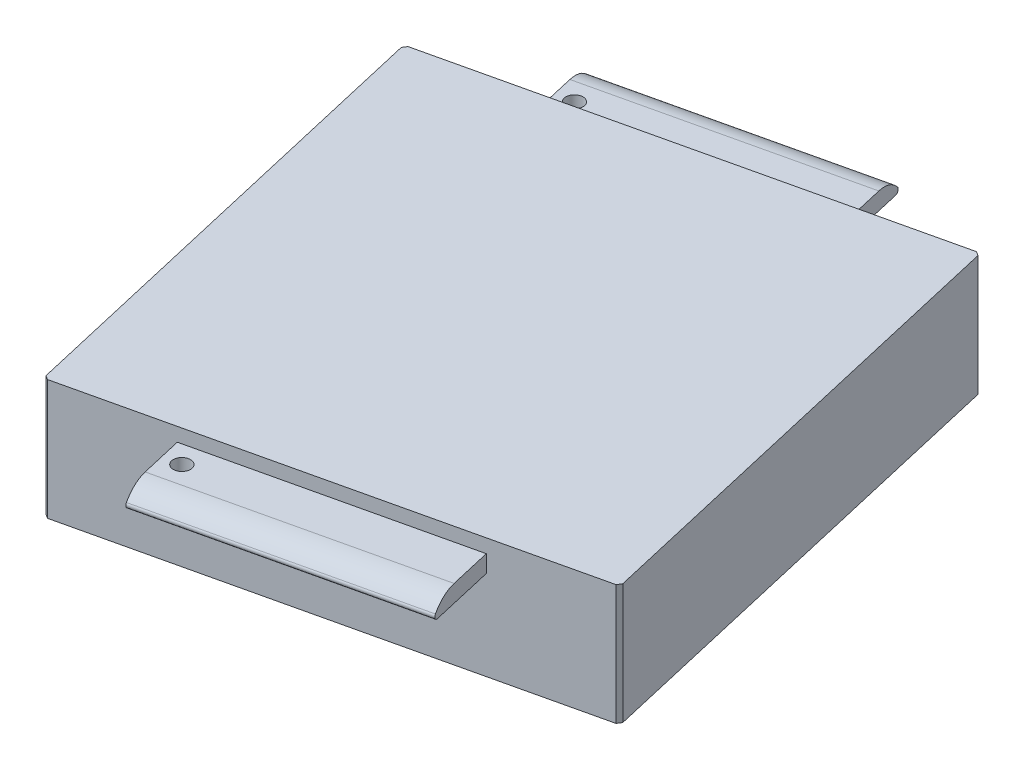
ISO-10303-21;
HEADER;
FILE_DESCRIPTION(('STEP AP214'),'2;1');
FILE_NAME('part.step','',(''),(''),'','','');
FILE_SCHEMA(('AUTOMOTIVE_DESIGN { 1 0 10303 214 1 1 1 1 }'));
ENDSEC;
DATA;
#1=APPLICATION_CONTEXT('core data for automotive mechanical design processes');
#2=APPLICATION_PROTOCOL_DEFINITION('international standard','automotive_design',2000,#1);
#3=PRODUCT_CONTEXT('',#1,'mechanical');
#4=PRODUCT('Part','Part','',(#3));
#5=PRODUCT_RELATED_PRODUCT_CATEGORY('part','',(#4));
#6=PRODUCT_DEFINITION_FORMATION('','',#4);
#7=PRODUCT_DEFINITION_CONTEXT('part definition',#1,'design');
#8=PRODUCT_DEFINITION('design','',#6,#7);
#9=PRODUCT_DEFINITION_SHAPE('','',#8);
#10=(LENGTH_UNIT() NAMED_UNIT(*) SI_UNIT(.MILLI.,.METRE.));
#11=(NAMED_UNIT(*) PLANE_ANGLE_UNIT() SI_UNIT($,.RADIAN.));
#12=(NAMED_UNIT(*) SI_UNIT($,.STERADIAN.) SOLID_ANGLE_UNIT());
#13=UNCERTAINTY_MEASURE_WITH_UNIT(LENGTH_MEASURE(1.E-05),#10,'distance_accuracy_value','');
#14=(GEOMETRIC_REPRESENTATION_CONTEXT(3) GLOBAL_UNCERTAINTY_ASSIGNED_CONTEXT((#13)) GLOBAL_UNIT_ASSIGNED_CONTEXT((#10,
#11,#12)) REPRESENTATION_CONTEXT('',''));
#15=CARTESIAN_POINT('',(0.,0.,0.));
#16=DIRECTION('',(0.,0.,1.));
#17=DIRECTION('',(1.,0.,0.));
#18=AXIS2_PLACEMENT_3D('',#15,#16,#17);
#19=CARTESIAN_POINT('',(321.32221095002,940.,-1642.4395520944));
#20=DIRECTION('',(-0.224951054343865,0.,-0.974370064785235));
#21=DIRECTION('',(-0.974370064785235,0.,0.224951054343865));
#22=AXIS2_PLACEMENT_3D('',#19,#20,#21);
#23=PLANE('',#22);
#24=DIRECTION('',(0.974370064785235,0.,-0.224951054343865));
#25=VECTOR('',#24,1.);
#26=CARTESIAN_POINT('',(321.32221095002,870.,-1642.4395520944));
#27=LINE('',#26,#25);
#28=CARTESIAN_POINT('',(321.32221095002,870.,-1642.4395520944));
#29=VERTEX_POINT('',#28);
#30=CARTESIAN_POINT('',(590.248348830745,870.,-1704.52604309331));
#31=VERTEX_POINT('',#30);
#32=EDGE_CURVE('E235',#29,#31,#27,.T.);
#33=ORIENTED_EDGE('',*,*,#32,.F.);
#34=DIRECTION('',(0.,-1.,0.));
#35=VECTOR('',#34,1.);
#36=CARTESIAN_POINT('',(321.32221095002,940.,-1642.4395520944));
#37=LINE('',#36,#35);
#38=CARTESIAN_POINT('',(321.32221095002,940.,-1642.4395520944));
#39=VERTEX_POINT('',#38);
#40=EDGE_CURVE('E11',#39,#29,#37,.T.);
#41=ORIENTED_EDGE('',*,*,#40,.F.);
#42=DIRECTION('',(0.974370064785235,0.,-0.224951054343865));
#43=VECTOR('',#42,1.);
#44=CARTESIAN_POINT('',(321.32221095002,940.,-1642.4395520944));
#45=LINE('',#44,#43);
#46=CARTESIAN_POINT('',(590.248348830745,940.,-1704.52604309331));
#47=VERTEX_POINT('',#46);
#48=EDGE_CURVE('E259',#39,#47,#45,.T.);
#49=ORIENTED_EDGE('',*,*,#48,.T.);
#50=DIRECTION('',(0.,-1.,0.));
#51=VECTOR('',#50,1.);
#52=CARTESIAN_POINT('',(590.248348830745,940.,-1704.52604309331));
#53=LINE('',#52,#51);
#54=EDGE_CURVE('E25',#47,#31,#53,.T.);
#55=ORIENTED_EDGE('',*,*,#54,.T.);
#56=EDGE_LOOP('',(#33,#41,#49,#55));
#57=FACE_BOUND('',#56,.T.);
#58=DIRECTION('',(0.974370064785235,0.,-0.224951054343865));
#59=VECTOR('',#58,1.);
#60=CARTESIAN_POINT('',(382.70752503149,932.,-1656.61146851807));
#61=LINE('',#60,#59);
#62=CARTESIAN_POINT('',(382.70752503149,932.,-1656.61146851807));
#63=VERTEX_POINT('',#62);
#64=CARTESIAN_POINT('',(528.863034749275,932.,-1690.35412666965));
#65=VERTEX_POINT('',#64);
#66=EDGE_CURVE('E32',#63,#65,#61,.T.);
#67=ORIENTED_EDGE('',*,*,#66,.F.);
#68=DIRECTION('',(0.,-1.,0.));
#69=VECTOR('',#68,1.);
#70=CARTESIAN_POINT('',(382.70752503149,932.,-1656.61146851807));
#71=LINE('',#70,#69);
#72=CARTESIAN_POINT('',(382.70752503149,922.,-1656.61146851807));
#73=VERTEX_POINT('',#72);
#74=EDGE_CURVE('E36',#63,#73,#71,.T.);
#75=ORIENTED_EDGE('',*,*,#74,.T.);
#76=DIRECTION('',(0.974370064785235,0.,-0.224951054343865));
#77=VECTOR('',#76,1.);
#78=CARTESIAN_POINT('',(382.70752503149,922.,-1656.61146851807));
#79=LINE('',#78,#77);
#80=CARTESIAN_POINT('',(528.863034749275,922.,-1690.35412666965));
#81=VERTEX_POINT('',#80);
#82=EDGE_CURVE('E136',#73,#81,#79,.T.);
#83=ORIENTED_EDGE('',*,*,#82,.T.);
#84=DIRECTION('',(0.,-1.,0.));
#85=VECTOR('',#84,1.);
#86=CARTESIAN_POINT('',(528.863034749275,932.,-1690.35412666965));
#87=LINE('',#86,#85);
#88=EDGE_CURVE('E139',#65,#81,#87,.T.);
#89=ORIENTED_EDGE('',*,*,#88,.F.);
#90=EDGE_LOOP('',(#67,#75,#83,#89));
#91=FACE_BOUND('',#90,.T.);
#92=ADVANCED_FACE('F17',(#57,#91),#23,.T.);
#93=CARTESIAN_POINT('',(319.823372929137,940.,-1640.04090985614));
#94=DIRECTION('',(-0.848048096156426,0.,-0.529919264233205));
#95=DIRECTION('',(-0.529919264233205,0.,0.848048096156426));
#96=AXIS2_PLACEMENT_3D('',#93,#94,#95);
#97=PLANE('',#96);
#98=DIRECTION('',(0.529919264233205,0.,-0.848048096156426));
#99=VECTOR('',#98,1.);
#100=CARTESIAN_POINT('',(319.823372929137,870.,-1640.04090985614));
#101=LINE('',#100,#99);
#102=CARTESIAN_POINT('',(319.823372929137,870.,-1640.04090985614));
#103=VERTEX_POINT('',#102);
#104=EDGE_CURVE('E232',#103,#29,#101,.T.);
#105=ORIENTED_EDGE('',*,*,#104,.F.);
#106=DIRECTION('',(0.,-1.,0.));
#107=VECTOR('',#106,1.);
#108=CARTESIAN_POINT('',(319.823372929137,940.,-1640.04090985614));
#109=LINE('',#108,#107);
#110=CARTESIAN_POINT('',(319.823372929137,940.,-1640.04090985614));
#111=VERTEX_POINT('',#110);
#112=EDGE_CURVE('E280',#111,#103,#109,.T.);
#113=ORIENTED_EDGE('',*,*,#112,.F.);
#114=DIRECTION('',(0.529919264233205,0.,-0.848048096156426));
#115=VECTOR('',#114,1.);
#116=CARTESIAN_POINT('',(319.823372929137,940.,-1640.04090985614));
#117=LINE('',#116,#115);
#118=EDGE_CURVE('E256',#111,#39,#117,.T.);
#119=ORIENTED_EDGE('',*,*,#118,.T.);
#120=ORIENTED_EDGE('',*,*,#40,.T.);
#121=EDGE_LOOP('',(#105,#113,#119,#120));
#122=FACE_BOUND('',#121,.T.);
#123=ADVANCED_FACE('F19',(#122),#97,.T.);
#124=CARTESIAN_POINT('',(590.248348830745,940.,-1704.52604309331));
#125=DIRECTION('',(0.529919264233205,0.,-0.848048096156426));
#126=DIRECTION('',(-0.848048096156426,0.,-0.529919264233205));
#127=AXIS2_PLACEMENT_3D('',#124,#125,#126);
#128=PLANE('',#127);
#129=DIRECTION('',(0.848048096156426,0.,0.529919264233205));
#130=VECTOR('',#129,1.);
#131=CARTESIAN_POINT('',(590.248348830745,870.,-1704.52604309331));
#132=LINE('',#131,#130);
#133=CARTESIAN_POINT('',(592.646991069003,870.,-1703.02720507243));
#134=VERTEX_POINT('',#133);
#135=EDGE_CURVE('E238',#31,#134,#132,.T.);
#136=ORIENTED_EDGE('',*,*,#135,.F.);
#137=ORIENTED_EDGE('',*,*,#54,.F.);
#138=DIRECTION('',(0.848048096156426,0.,0.529919264233205));
#139=VECTOR('',#138,1.);
#140=CARTESIAN_POINT('',(590.248348830745,940.,-1704.52604309331));
#141=LINE('',#140,#139);
#142=CARTESIAN_POINT('',(592.646991069003,940.,-1703.02720507243));
#143=VERTEX_POINT('',#142);
#144=EDGE_CURVE('E262',#47,#143,#141,.T.);
#145=ORIENTED_EDGE('',*,*,#144,.T.);
#146=DIRECTION('',(0.,-1.,0.));
#147=VECTOR('',#146,1.);
#148=CARTESIAN_POINT('',(592.646991069003,940.,-1703.02720507243));
#149=LINE('',#148,#147);
#150=EDGE_CURVE('E292',#143,#134,#149,.T.);
#151=ORIENTED_EDGE('',*,*,#150,.T.);
#152=EDGE_LOOP('',(#136,#137,#145,#151));
#153=FACE_BOUND('',#152,.T.);
#154=ADVANCED_FACE('F299',(#153),#128,.T.);
#155=CARTESIAN_POINT('',(592.646991069003,940.,-1703.02720507243));
#156=DIRECTION('',(0.974370064785235,0.,-0.224951054343865));
#157=DIRECTION('',(-0.224951054343865,0.,-0.974370064785235));
#158=AXIS2_PLACEMENT_3D('',#155,#156,#157);
#159=PLANE('',#158);
#160=DIRECTION('',(0.224951054343865,0.,0.974370064785235));
#161=VECTOR('',#160,1.);
#162=CARTESIAN_POINT('',(592.646991069003,870.,-1703.02720507243));
#163=LINE('',#162,#161);
#164=CARTESIAN_POINT('',(654.73348206791,870.,-1434.1010671917));
#165=VERTEX_POINT('',#164);
#166=EDGE_CURVE('E241',#134,#165,#163,.T.);
#167=ORIENTED_EDGE('',*,*,#166,.F.);
#168=ORIENTED_EDGE('',*,*,#150,.F.);
#169=DIRECTION('',(0.224951054343865,0.,0.974370064785235));
#170=VECTOR('',#169,1.);
#171=CARTESIAN_POINT('',(592.646991069003,940.,-1703.02720507243));
#172=LINE('',#171,#170);
#173=CARTESIAN_POINT('',(654.73348206791,940.,-1434.1010671917));
#174=VERTEX_POINT('',#173);
#175=EDGE_CURVE('E265',#143,#174,#172,.T.);
#176=ORIENTED_EDGE('',*,*,#175,.T.);
#177=DIRECTION('',(0.,-1.,0.));
#178=VECTOR('',#177,1.);
#179=CARTESIAN_POINT('',(654.73348206791,940.,-1434.1010671917));
#180=LINE('',#179,#178);
#181=EDGE_CURVE('E290',#174,#165,#180,.T.);
#182=ORIENTED_EDGE('',*,*,#181,.T.);
#183=EDGE_LOOP('',(#167,#168,#176,#182));
#184=FACE_BOUND('',#183,.T.);
#185=ADVANCED_FACE('F314',(#184),#159,.T.);
#186=CARTESIAN_POINT('',(654.73348206791,940.,-1434.1010671917));
#187=DIRECTION('',(0.848048096156426,0.,0.529919264233205));
#188=DIRECTION('',(0.529919264233205,0.,-0.848048096156426));
#189=AXIS2_PLACEMENT_3D('',#186,#187,#188);
#190=PLANE('',#189);
#191=DIRECTION('',(-0.529919264233205,0.,0.848048096156426));
#192=VECTOR('',#191,1.);
#193=CARTESIAN_POINT('',(654.73348206791,870.,-1434.1010671917));
#194=LINE('',#193,#192);
#195=CARTESIAN_POINT('',(653.234644047027,870.,-1431.70242495344));
#196=VERTEX_POINT('',#195);
#197=EDGE_CURVE('E244',#165,#196,#194,.T.);
#198=ORIENTED_EDGE('',*,*,#197,.F.);
#199=ORIENTED_EDGE('',*,*,#181,.F.);
#200=DIRECTION('',(-0.529919264233205,0.,0.848048096156426));
#201=VECTOR('',#200,1.);
#202=CARTESIAN_POINT('',(654.73348206791,940.,-1434.1010671917));
#203=LINE('',#202,#201);
#204=CARTESIAN_POINT('',(653.234644047027,940.,-1431.70242495344));
#205=VERTEX_POINT('',#204);
#206=EDGE_CURVE('E268',#174,#205,#203,.T.);
#207=ORIENTED_EDGE('',*,*,#206,.T.);
#208=DIRECTION('',(0.,-1.,0.));
#209=VECTOR('',#208,1.);
#210=CARTESIAN_POINT('',(653.234644047027,940.,-1431.70242495344));
#211=LINE('',#210,#209);
#212=EDGE_CURVE('E288',#205,#196,#211,.T.);
#213=ORIENTED_EDGE('',*,*,#212,.T.);
#214=EDGE_LOOP('',(#198,#199,#207,#213));
#215=FACE_BOUND('',#214,.T.);
#216=ADVANCED_FACE('F318',(#215),#190,.T.);
#217=CARTESIAN_POINT('',(653.234644047027,940.,-1431.70242495344));
#218=DIRECTION('',(0.224951054343865,0.,0.974370064785235));
#219=DIRECTION('',(0.974370064785235,0.,-0.224951054343865));
#220=AXIS2_PLACEMENT_3D('',#217,#218,#219);
#221=PLANE('',#220);
#222=DIRECTION('',(0.,-1.,0.));
#223=VECTOR('',#222,1.);
#224=CARTESIAN_POINT('',(445.693820247772,932.,-1383.7878503782));
#225=LINE('',#224,#223);
#226=CARTESIAN_POINT('',(445.693820247772,932.,-1383.7878503782));
#227=VERTEX_POINT('',#226);
#228=CARTESIAN_POINT('',(445.693820247772,922.,-1383.7878503782));
#229=VERTEX_POINT('',#228);
#230=EDGE_CURVE('E205',#227,#229,#225,.T.);
#231=ORIENTED_EDGE('',*,*,#230,.F.);
#232=DIRECTION('',(0.974370064785235,0.,-0.224951054343865));
#233=VECTOR('',#232,1.);
#234=CARTESIAN_POINT('',(445.693820247772,932.,-1383.7878503782));
#235=LINE('',#234,#233);
#236=CARTESIAN_POINT('',(591.849329965557,932.,-1417.53050852978));
#237=VERTEX_POINT('',#236);
#238=EDGE_CURVE('E230',#227,#237,#235,.T.);
#239=ORIENTED_EDGE('',*,*,#238,.T.);
#240=DIRECTION('',(0.,-1.,0.));
#241=VECTOR('',#240,1.);
#242=CARTESIAN_POINT('',(591.849329965557,932.,-1417.53050852978));
#243=LINE('',#242,#241);
#244=CARTESIAN_POINT('',(591.849329965557,922.,-1417.53050852978));
#245=VERTEX_POINT('',#244);
#246=EDGE_CURVE('E191',#237,#245,#243,.T.);
#247=ORIENTED_EDGE('',*,*,#246,.T.);
#248=DIRECTION('',(0.974370064785235,0.,-0.224951054343865));
#249=VECTOR('',#248,1.);
#250=CARTESIAN_POINT('',(445.693820247772,922.,-1383.7878503782));
#251=LINE('',#250,#249);
#252=EDGE_CURVE('E227',#229,#245,#251,.T.);
#253=ORIENTED_EDGE('',*,*,#252,.F.);
#254=EDGE_LOOP('',(#231,#239,#247,#253));
#255=FACE_BOUND('',#254,.T.);
#256=DIRECTION('',(-0.974370064785235,0.,0.224951054343865));
#257=VECTOR('',#256,1.);
#258=CARTESIAN_POINT('',(653.234644047027,870.,-1431.70242495344));
#259=LINE('',#258,#257);
#260=CARTESIAN_POINT('',(384.308506166301,870.,-1369.61593395454));
#261=VERTEX_POINT('',#260);
#262=EDGE_CURVE('E247',#196,#261,#259,.T.);
#263=ORIENTED_EDGE('',*,*,#262,.F.);
#264=ORIENTED_EDGE('',*,*,#212,.F.);
#265=DIRECTION('',(-0.974370064785235,0.,0.224951054343865));
#266=VECTOR('',#265,1.);
#267=CARTESIAN_POINT('',(653.234644047027,940.,-1431.70242495344));
#268=LINE('',#267,#266);
#269=CARTESIAN_POINT('',(384.308506166301,940.,-1369.61593395454));
#270=VERTEX_POINT('',#269);
#271=EDGE_CURVE('E271',#205,#270,#268,.T.);
#272=ORIENTED_EDGE('',*,*,#271,.T.);
#273=DIRECTION('',(0.,-1.,0.));
#274=VECTOR('',#273,1.);
#275=CARTESIAN_POINT('',(384.308506166301,940.,-1369.61593395454));
#276=LINE('',#275,#274);
#277=EDGE_CURVE('E286',#270,#261,#276,.T.);
#278=ORIENTED_EDGE('',*,*,#277,.T.);
#279=EDGE_LOOP('',(#263,#264,#272,#278));
#280=FACE_BOUND('',#279,.T.);
#281=ADVANCED_FACE('F320',(#255,#280),#221,.T.);
#282=CARTESIAN_POINT('',(384.308506166301,940.,-1369.61593395454));
#283=DIRECTION('',(-0.529919264233205,0.,0.848048096156426));
#284=DIRECTION('',(0.848048096156426,0.,0.529919264233205));
#285=AXIS2_PLACEMENT_3D('',#282,#283,#284);
#286=PLANE('',#285);
#287=DIRECTION('',(-0.848048096156426,0.,-0.529919264233205));
#288=VECTOR('',#287,1.);
#289=CARTESIAN_POINT('',(384.308506166301,870.,-1369.61593395454));
#290=LINE('',#289,#288);
#291=CARTESIAN_POINT('',(381.909863928044,870.,-1371.11477197542));
#292=VERTEX_POINT('',#291);
#293=EDGE_CURVE('E250',#261,#292,#290,.T.);
#294=ORIENTED_EDGE('',*,*,#293,.F.);
#295=ORIENTED_EDGE('',*,*,#277,.F.);
#296=DIRECTION('',(-0.848048096156426,0.,-0.529919264233205));
#297=VECTOR('',#296,1.);
#298=CARTESIAN_POINT('',(384.308506166301,940.,-1369.61593395454));
#299=LINE('',#298,#297);
#300=CARTESIAN_POINT('',(381.909863928044,940.,-1371.11477197542));
#301=VERTEX_POINT('',#300);
#302=EDGE_CURVE('E274',#270,#301,#299,.T.);
#303=ORIENTED_EDGE('',*,*,#302,.T.);
#304=DIRECTION('',(0.,-1.,0.));
#305=VECTOR('',#304,1.);
#306=CARTESIAN_POINT('',(381.909863928044,940.,-1371.11477197542));
#307=LINE('',#306,#305);
#308=EDGE_CURVE('E284',#301,#292,#307,.T.);
#309=ORIENTED_EDGE('',*,*,#308,.T.);
#310=EDGE_LOOP('',(#294,#295,#303,#309));
#311=FACE_BOUND('',#310,.T.);
#312=ADVANCED_FACE('F324',(#311),#286,.T.);
#313=CARTESIAN_POINT('',(381.909863928044,940.,-1371.11477197542));
#314=DIRECTION('',(-0.974370064785235,0.,0.224951054343865));
#315=DIRECTION('',(0.224951054343865,0.,0.974370064785235));
#316=AXIS2_PLACEMENT_3D('',#313,#314,#315);
#317=PLANE('',#316);
#318=DIRECTION('',(-0.224951054343865,0.,-0.974370064785235));
#319=VECTOR('',#318,1.);
#320=CARTESIAN_POINT('',(381.909863928044,870.,-1371.11477197542));
#321=LINE('',#320,#319);
#322=EDGE_CURVE('E253',#292,#103,#321,.T.);
#323=ORIENTED_EDGE('',*,*,#322,.F.);
#324=ORIENTED_EDGE('',*,*,#308,.F.);
#325=DIRECTION('',(-0.224951054343865,0.,-0.974370064785235));
#326=VECTOR('',#325,1.);
#327=CARTESIAN_POINT('',(381.909863928044,940.,-1371.11477197542));
#328=LINE('',#327,#326);
#329=EDGE_CURVE('E277',#301,#111,#328,.T.);
#330=ORIENTED_EDGE('',*,*,#329,.T.);
#331=ORIENTED_EDGE('',*,*,#112,.T.);
#332=EDGE_LOOP('',(#323,#324,#330,#331));
#333=FACE_BOUND('',#332,.T.);
#334=ADVANCED_FACE('F326',(#333),#317,.T.);
#335=CARTESIAN_POINT('',(424.742034390929,940.,-1807.94586653422));
#336=DIRECTION('',(0.,-1.,0.));
#337=DIRECTION('',(-0.224951054343865,0.,-0.974370064785235));
#338=AXIS2_PLACEMENT_3D('',#335,#336,#337);
#339=PLANE('',#338);
#340=ORIENTED_EDGE('',*,*,#118,.F.);
#341=ORIENTED_EDGE('',*,*,#329,.F.);
#342=ORIENTED_EDGE('',*,*,#302,.F.);
#343=ORIENTED_EDGE('',*,*,#271,.F.);
#344=ORIENTED_EDGE('',*,*,#206,.F.);
#345=ORIENTED_EDGE('',*,*,#175,.F.);
#346=ORIENTED_EDGE('',*,*,#144,.F.);
#347=ORIENTED_EDGE('',*,*,#48,.F.);
#348=EDGE_LOOP('',(#340,#341,#342,#343,#344,#345,#346,#347));
#349=FACE_BOUND('',#348,.T.);
#350=ADVANCED_FACE('F308',(#349),#339,.F.);
#351=CARTESIAN_POINT('',(424.742034390929,870.,-1807.94586653422));
#352=DIRECTION('',(0.,-1.,0.));
#353=DIRECTION('',(-0.224951054343865,0.,-0.974370064785235));
#354=AXIS2_PLACEMENT_3D('',#351,#352,#353);
#355=PLANE('',#354);
#356=ORIENTED_EDGE('',*,*,#104,.T.);
#357=ORIENTED_EDGE('',*,*,#32,.T.);
#358=ORIENTED_EDGE('',*,*,#135,.T.);
#359=ORIENTED_EDGE('',*,*,#166,.T.);
#360=ORIENTED_EDGE('',*,*,#197,.T.);
#361=ORIENTED_EDGE('',*,*,#262,.T.);
#362=ORIENTED_EDGE('',*,*,#293,.T.);
#363=ORIENTED_EDGE('',*,*,#322,.T.);
#364=EDGE_LOOP('',(#356,#357,#358,#359,#360,#361,#362,#363));
#365=FACE_BOUND('',#364,.T.);
#366=ADVANCED_FACE('F302',(#365),#355,.T.);
#367=CARTESIAN_POINT('',(451.317596606368,932.,-1359.42859875857));
#368=DIRECTION('',(0.,1.,0.));
#369=DIRECTION('',(0.224951054343865,0.,0.974370064785235));
#370=AXIS2_PLACEMENT_3D('',#367,#368,#369);
#371=PLANE('',#370);
#372=CARTESIAN_POINT('',(458.249409074923,932.,-1373.85773511182));
#373=DIRECTION('',(0.,1.,0.));
#374=DIRECTION('',(0.224951054343865,0.,0.974370064785235));
#375=AXIS2_PLACEMENT_3D('',#372,#373,#374);
#376=CIRCLE('',#375,5.);
#377=CARTESIAN_POINT('',(459.374164346642,932.,-1368.9858847879));
#378=VERTEX_POINT('',#377);
#379=EDGE_CURVE('E185',#378,#378,#376,.T.);
#380=ORIENTED_EDGE('',*,*,#379,.F.);
#381=EDGE_LOOP('',(#380));
#382=FACE_BOUND('',#381,.T.);
#383=DIRECTION('',(-0.224951054343865,0.,-0.974370064785235));
#384=VECTOR('',#383,1.);
#385=CARTESIAN_POINT('',(597.473106324153,932.,-1393.17125691015));
#386=LINE('',#385,#384);
#387=CARTESIAN_POINT('',(597.473106324153,932.,-1393.17125691015));
#388=VERTEX_POINT('',#387);
#389=EDGE_CURVE('E194',#388,#237,#386,.T.);
#390=ORIENTED_EDGE('',*,*,#389,.T.);
#391=ORIENTED_EDGE('',*,*,#238,.F.);
#392=DIRECTION('',(-0.224951054343865,0.,-0.974370064785235));
#393=VECTOR('',#392,1.);
#394=CARTESIAN_POINT('',(451.317596606368,932.,-1359.42859875857));
#395=LINE('',#394,#393);
#396=CARTESIAN_POINT('',(451.317596606368,932.,-1359.42859875857));
#397=VERTEX_POINT('',#396);
#398=EDGE_CURVE('E202',#397,#227,#395,.T.);
#399=ORIENTED_EDGE('',*,*,#398,.F.);
#400=DIRECTION('',(0.974370064785235,0.,-0.224951054343865));
#401=VECTOR('',#400,1.);
#402=CARTESIAN_POINT('',(451.317596606368,932.,-1359.42859875857));
#403=LINE('',#402,#401);
#404=EDGE_CURVE('E216',#397,#388,#403,.T.);
#405=ORIENTED_EDGE('',*,*,#404,.T.);
#406=EDGE_LOOP('',(#390,#391,#399,#405));
#407=FACE_BOUND('',#406,.T.);
#408=ADVANCED_FACE('F359',(#382,#407),#371,.T.);
#409=CARTESIAN_POINT('',(445.693820247772,922.,-1383.7878503782));
#410=DIRECTION('',(0.,-1.,0.));
#411=DIRECTION('',(-0.224951054343865,0.,-0.974370064785235));
#412=AXIS2_PLACEMENT_3D('',#409,#410,#411);
#413=PLANE('',#412);
#414=CARTESIAN_POINT('',(458.249409074922,922.,-1373.85773511182));
#415=DIRECTION('',(0.,1.,0.));
#416=DIRECTION('',(-0.224951054343865,0.,-0.974370064785235));
#417=AXIS2_PLACEMENT_3D('',#414,#415,#416);
#418=CIRCLE('',#417,5.);
#419=CARTESIAN_POINT('',(457.124653803203,922.,-1378.72958543575));
#420=VERTEX_POINT('',#419);
#421=EDGE_CURVE('E190',#420,#420,#418,.T.);
#422=ORIENTED_EDGE('',*,*,#421,.T.);
#423=EDGE_LOOP('',(#422));
#424=FACE_BOUND('',#423,.T.);
#425=DIRECTION('',(0.224951054343865,0.,0.974370064785235));
#426=VECTOR('',#425,1.);
#427=CARTESIAN_POINT('',(591.849329965557,922.,-1417.53050852978));
#428=LINE('',#427,#426);
#429=CARTESIAN_POINT('',(600.397470030624,922.,-1380.50444606794));
#430=VERTEX_POINT('',#429);
#431=EDGE_CURVE('E193',#245,#430,#428,.T.);
#432=ORIENTED_EDGE('',*,*,#431,.T.);
#433=DIRECTION('',(0.974370064785235,0.,-0.224951054343865));
#434=VECTOR('',#433,1.);
#435=CARTESIAN_POINT('',(454.241960312839,922.,-1346.76178791636));
#436=LINE('',#435,#434);
#437=CARTESIAN_POINT('',(454.241960312839,922.,-1346.76178791636));
#438=VERTEX_POINT('',#437);
#439=EDGE_CURVE('E224',#438,#430,#436,.T.);
#440=ORIENTED_EDGE('',*,*,#439,.F.);
#441=DIRECTION('',(0.224951054343865,0.,0.974370064785235));
#442=VECTOR('',#441,1.);
#443=CARTESIAN_POINT('',(445.693820247772,922.,-1383.7878503782));
#444=LINE('',#443,#442);
#445=EDGE_CURVE('E208',#229,#438,#444,.T.);
#446=ORIENTED_EDGE('',*,*,#445,.F.);
#447=ORIENTED_EDGE('',*,*,#252,.T.);
#448=EDGE_LOOP('',(#432,#440,#446,#447));
#449=FACE_BOUND('',#448,.T.);
#450=ADVANCED_FACE('F366',(#424,#449),#413,.T.);
#451=CARTESIAN_POINT('',(454.241960312839,924.,-1346.76178791636));
#452=DIRECTION('',(0.974370064785235,0.,-0.224951054343865));
#453=DIRECTION('',(-0.224951054343865,0.,-0.974370064785235));
#454=AXIS2_PLACEMENT_3D('',#451,#452,#453);
#455=CYLINDRICAL_SURFACE('',#454,2.);
#456=CARTESIAN_POINT('',(600.397470030624,924.,-1380.50444606794));
#457=DIRECTION('',(-0.974370064785235,0.,0.224951054343865));
#458=DIRECTION('',(0.,-1.,0.));
#459=AXIS2_PLACEMENT_3D('',#456,#457,#458);
#460=CIRCLE('',#459,2.);
#461=CARTESIAN_POINT('',(600.74049430676,925.294113061495,-1379.01864469156));
#462=VERTEX_POINT('',#461);
#463=EDGE_CURVE('E197',#430,#462,#460,.T.);
#464=ORIENTED_EDGE('',*,*,#463,.T.);
#465=DIRECTION('',(0.974370064785235,0.,-0.224951054343865));
#466=VECTOR('',#465,1.);
#467=CARTESIAN_POINT('',(454.584984588975,925.294113061495,-1345.27598653998));
#468=LINE('',#467,#466);
#469=CARTESIAN_POINT('',(454.584984588975,925.294113061495,-1345.27598653998));
#470=VERTEX_POINT('',#469);
#471=EDGE_CURVE('E221',#470,#462,#468,.T.);
#472=ORIENTED_EDGE('',*,*,#471,.F.);
#473=CARTESIAN_POINT('',(454.241960312839,924.,-1346.76178791636));
#474=DIRECTION('',(-0.974370064785235,0.,0.224951054343865));
#475=DIRECTION('',(0.,-1.,0.));
#476=AXIS2_PLACEMENT_3D('',#473,#474,#475);
#477=CIRCLE('',#476,2.);
#478=EDGE_CURVE('E211',#438,#470,#477,.T.);
#479=ORIENTED_EDGE('',*,*,#478,.F.);
#480=ORIENTED_EDGE('',*,*,#439,.T.);
#481=EDGE_LOOP('',(#464,#472,#479,#480));
#482=FACE_BOUND('',#481,.T.);
#483=ADVANCED_FACE('F369',(#482),#455,.T.);
#484=CARTESIAN_POINT('',(451.326253965679,913.000038977292,-1359.39109961558));
#485=DIRECTION('',(0.974370064785235,0.,-0.224951054343865));
#486=DIRECTION('',(-0.224951054343865,0.,-0.974370064785235));
#487=AXIS2_PLACEMENT_3D('',#484,#485,#486);
#488=CYLINDRICAL_SURFACE('',#487,19.);
#489=CARTESIAN_POINT('',(597.481763683464,913.000038977292,-1393.13375776716));
#490=DIRECTION('',(-0.974370064785236,0.,0.224951054343865));
#491=DIRECTION('',(-0.000455650490026853,0.999997948563554,-0.00197363910465158));
#492=AXIS2_PLACEMENT_3D('',#489,#490,#491);
#493=CIRCLE('',#492,19.);
#494=EDGE_CURVE('E200',#462,#388,#493,.T.);
#495=ORIENTED_EDGE('',*,*,#494,.T.);
#496=ORIENTED_EDGE('',*,*,#404,.F.);
#497=CARTESIAN_POINT('',(451.326253965679,913.000038977292,-1359.39109961558));
#498=DIRECTION('',(-0.974370064785236,0.,0.224951054343865));
#499=DIRECTION('',(-0.000455650490026853,0.999997948563554,-0.00197363910465158));
#500=AXIS2_PLACEMENT_3D('',#497,#498,#499);
#501=CIRCLE('',#500,19.);
#502=EDGE_CURVE('E214',#470,#397,#501,.T.);
#503=ORIENTED_EDGE('',*,*,#502,.F.);
#504=ORIENTED_EDGE('',*,*,#471,.T.);
#505=EDGE_LOOP('',(#495,#496,#503,#504));
#506=FACE_BOUND('',#505,.T.);
#507=ADVANCED_FACE('F371',(#506),#488,.T.);
#508=CARTESIAN_POINT('',(454.241960312839,924.,-1346.76178791636));
#509=DIRECTION('',(0.974370064785235,0.,-0.224951054343865));
#510=DIRECTION('',(-0.224951054343865,0.,-0.974370064785235));
#511=AXIS2_PLACEMENT_3D('',#508,#509,#510);
#512=PLANE('',#511);
#513=ORIENTED_EDGE('',*,*,#398,.T.);
#514=ORIENTED_EDGE('',*,*,#230,.T.);
#515=ORIENTED_EDGE('',*,*,#445,.T.);
#516=ORIENTED_EDGE('',*,*,#478,.T.);
#517=ORIENTED_EDGE('',*,*,#502,.T.);
#518=EDGE_LOOP('',(#513,#514,#515,#516,#517));
#519=FACE_BOUND('',#518,.T.);
#520=ADVANCED_FACE('F356',(#519),#512,.F.);
#521=CARTESIAN_POINT('',(600.397470030624,924.,-1380.50444606794));
#522=DIRECTION('',(0.974370064785235,0.,-0.224951054343865));
#523=DIRECTION('',(-0.224951054343865,0.,-0.974370064785235));
#524=AXIS2_PLACEMENT_3D('',#521,#522,#523);
#525=PLANE('',#524);
#526=ORIENTED_EDGE('',*,*,#389,.F.);
#527=ORIENTED_EDGE('',*,*,#494,.F.);
#528=ORIENTED_EDGE('',*,*,#463,.F.);
#529=ORIENTED_EDGE('',*,*,#431,.F.);
#530=ORIENTED_EDGE('',*,*,#246,.F.);
#531=EDGE_LOOP('',(#526,#527,#528,#529,#530));
#532=FACE_BOUND('',#531,.T.);
#533=ADVANCED_FACE('F362',(#532),#525,.T.);
#534=CARTESIAN_POINT('',(458.249409074922,916.999999999951,-1373.85773511182));
#535=DIRECTION('',(0.,1.,0.));
#536=DIRECTION('',(0.224951054343865,0.,0.974370064785235));
#537=AXIS2_PLACEMENT_3D('',#534,#535,#536);
#538=CYLINDRICAL_SURFACE('',#537,5.);
#539=ORIENTED_EDGE('',*,*,#421,.F.);
#540=EDGE_LOOP('',(#539));
#541=FACE_BOUND('',#540,.T.);
#542=ORIENTED_EDGE('',*,*,#379,.T.);
#543=EDGE_LOOP('',(#542));
#544=FACE_BOUND('',#543,.T.);
#545=ADVANCED_FACE('F434',(#541,#544),#538,.F.);
#546=CARTESIAN_POINT('',(377.083748672894,932.,-1680.97072013769));
#547=DIRECTION('',(0.,1.,0.));
#548=DIRECTION('',(-0.224951054343865,0.,-0.974370064785235));
#549=AXIS2_PLACEMENT_3D('',#546,#547,#548);
#550=PLANE('',#549);
#551=CARTESIAN_POINT('',(389.639337500044,932.,-1671.04060487132));
#552=DIRECTION('',(0.,-1.,0.));
#553=DIRECTION('',(-0.224951054343865,0.,-0.974370064785235));
#554=AXIS2_PLACEMENT_3D('',#551,#552,#553);
#555=CIRCLE('',#554,5.);
#556=CARTESIAN_POINT('',(388.514582228325,932.,-1675.91245519525));
#557=VERTEX_POINT('',#556);
#558=EDGE_CURVE('E162',#557,#557,#555,.T.);
#559=ORIENTED_EDGE('',*,*,#558,.T.);
#560=EDGE_LOOP('',(#559));
#561=FACE_BOUND('',#560,.T.);
#562=DIRECTION('',(0.224951054343865,0.,0.974370064785235));
#563=VECTOR('',#562,1.);
#564=CARTESIAN_POINT('',(523.239258390679,932.,-1714.71337828927));
#565=LINE('',#564,#563);
#566=CARTESIAN_POINT('',(523.239258390679,932.,-1714.71337828927));
#567=VERTEX_POINT('',#566);
#568=EDGE_CURVE('E157',#567,#65,#565,.T.);
#569=ORIENTED_EDGE('',*,*,#568,.F.);
#570=DIRECTION('',(0.974370064785235,0.,-0.224951054343865));
#571=VECTOR('',#570,1.);
#572=CARTESIAN_POINT('',(377.083748672894,932.,-1680.97072013769));
#573=LINE('',#572,#571);
#574=CARTESIAN_POINT('',(377.083748672894,932.,-1680.97072013769));
#575=VERTEX_POINT('',#574);
#576=EDGE_CURVE('E177',#575,#567,#573,.T.);
#577=ORIENTED_EDGE('',*,*,#576,.F.);
#578=DIRECTION('',(0.224951054343865,0.,0.974370064785235));
#579=VECTOR('',#578,1.);
#580=CARTESIAN_POINT('',(377.083748672894,932.,-1680.97072013769));
#581=LINE('',#580,#579);
#582=EDGE_CURVE('E166',#575,#63,#581,.T.);
#583=ORIENTED_EDGE('',*,*,#582,.T.);
#584=ORIENTED_EDGE('',*,*,#66,.T.);
#585=EDGE_LOOP('',(#569,#577,#583,#584));
#586=FACE_BOUND('',#585,.T.);
#587=ADVANCED_FACE('F442',(#561,#586),#550,.T.);
#588=CARTESIAN_POINT('',(382.70752503149,922.,-1656.61146851807));
#589=DIRECTION('',(0.,-1.,0.));
#590=DIRECTION('',(0.224951054343865,0.,0.974370064785235));
#591=AXIS2_PLACEMENT_3D('',#588,#589,#590);
#592=PLANE('',#591);
#593=CARTESIAN_POINT('',(389.639337500043,922.,-1671.04060487132));
#594=DIRECTION('',(0.,-1.,0.));
#595=DIRECTION('',(0.224951054343865,0.,0.974370064785235));
#596=AXIS2_PLACEMENT_3D('',#593,#594,#595);
#597=CIRCLE('',#596,5.);
#598=CARTESIAN_POINT('',(390.764092771763,922.,-1666.16875454739));
#599=VERTEX_POINT('',#598);
#600=EDGE_CURVE('E159',#599,#599,#597,.T.);
#601=ORIENTED_EDGE('',*,*,#600,.F.);
#602=EDGE_LOOP('',(#601));
#603=FACE_BOUND('',#602,.T.);
#604=DIRECTION('',(-0.224951054343865,0.,-0.974370064785235));
#605=VECTOR('',#604,1.);
#606=CARTESIAN_POINT('',(528.863034749275,922.,-1690.35412666965));
#607=LINE('',#606,#605);
#608=CARTESIAN_POINT('',(520.314894684208,922.,-1727.38018913149));
#609=VERTEX_POINT('',#608);
#610=EDGE_CURVE('E146',#81,#609,#607,.T.);
#611=ORIENTED_EDGE('',*,*,#610,.F.);
#612=ORIENTED_EDGE('',*,*,#82,.F.);
#613=DIRECTION('',(-0.224951054343865,0.,-0.974370064785235));
#614=VECTOR('',#613,1.);
#615=CARTESIAN_POINT('',(382.70752503149,922.,-1656.61146851807));
#616=LINE('',#615,#614);
#617=CARTESIAN_POINT('',(374.159384966423,922.,-1693.63753097991));
#618=VERTEX_POINT('',#617);
#619=EDGE_CURVE('E169',#73,#618,#616,.T.);
#620=ORIENTED_EDGE('',*,*,#619,.T.);
#621=DIRECTION('',(0.974370064785235,0.,-0.224951054343865));
#622=VECTOR('',#621,1.);
#623=CARTESIAN_POINT('',(374.159384966423,922.,-1693.63753097991));
#624=LINE('',#623,#622);
#625=EDGE_CURVE('E143',#618,#609,#624,.T.);
#626=ORIENTED_EDGE('',*,*,#625,.T.);
#627=EDGE_LOOP('',(#611,#612,#620,#626));
#628=FACE_BOUND('',#627,.T.);
#629=ADVANCED_FACE('F147',(#603,#628),#592,.T.);
#630=CARTESIAN_POINT('',(374.159384966423,924.,-1693.63753097991));
#631=DIRECTION('',(0.974370064785235,0.,-0.224951054343865));
#632=DIRECTION('',(0.224951054343865,0.,0.974370064785235));
#633=AXIS2_PLACEMENT_3D('',#630,#631,#632);
#634=CYLINDRICAL_SURFACE('',#633,2.);
#635=CARTESIAN_POINT('',(520.314894684208,924.,-1727.38018913149));
#636=DIRECTION('',(0.974370064785235,0.,-0.224951054343865));
#637=DIRECTION('',(0.,-1.,0.));
#638=AXIS2_PLACEMENT_3D('',#635,#636,#637);
#639=CIRCLE('',#638,2.);
#640=CARTESIAN_POINT('',(519.971870408072,925.294113061495,-1728.86599050787));
#641=VERTEX_POINT('',#640);
#642=EDGE_CURVE('E151',#609,#641,#639,.T.);
#643=ORIENTED_EDGE('',*,*,#642,.F.);
#644=ORIENTED_EDGE('',*,*,#625,.F.);
#645=CARTESIAN_POINT('',(374.159384966423,924.,-1693.63753097991));
#646=DIRECTION('',(0.974370064785235,0.,-0.224951054343865));
#647=DIRECTION('',(0.,-1.,0.));
#648=AXIS2_PLACEMENT_3D('',#645,#646,#647);
#649=CIRCLE('',#648,2.);
#650=CARTESIAN_POINT('',(373.816360690287,925.294113061495,-1695.12333235629));
#651=VERTEX_POINT('',#650);
#652=EDGE_CURVE('E171',#618,#651,#649,.T.);
#653=ORIENTED_EDGE('',*,*,#652,.T.);
#654=DIRECTION('',(0.974370064785235,0.,-0.224951054343865));
#655=VECTOR('',#654,1.);
#656=CARTESIAN_POINT('',(373.816360690287,925.294113061495,-1695.12333235629));
#657=LINE('',#656,#655);
#658=EDGE_CURVE('E181',#651,#641,#657,.T.);
#659=ORIENTED_EDGE('',*,*,#658,.T.);
#660=EDGE_LOOP('',(#643,#644,#653,#659));
#661=FACE_BOUND('',#660,.T.);
#662=ADVANCED_FACE('F461',(#661),#634,.T.);
#663=CARTESIAN_POINT('',(377.075091313582,913.000038977292,-1681.00821928069));
#664=DIRECTION('',(0.974370064785235,0.,-0.224951054343865));
#665=DIRECTION('',(0.224951054343865,0.,0.974370064785235));
#666=AXIS2_PLACEMENT_3D('',#663,#664,#665);
#667=CYLINDRICAL_SURFACE('',#666,19.);
#668=CARTESIAN_POINT('',(523.230601031368,913.000038977292,-1714.75087743226));
#669=DIRECTION('',(0.974370064785236,0.,-0.224951054343866));
#670=DIRECTION('',(0.000455650490024363,0.999997948563554,0.00197363910465178));
#671=AXIS2_PLACEMENT_3D('',#668,#669,#670);
#672=CIRCLE('',#671,19.);
#673=EDGE_CURVE('E165',#641,#567,#672,.T.);
#674=ORIENTED_EDGE('',*,*,#673,.F.);
#675=ORIENTED_EDGE('',*,*,#658,.F.);
#676=CARTESIAN_POINT('',(377.075091313582,913.000038977292,-1681.00821928069));
#677=DIRECTION('',(0.974370064785236,0.,-0.224951054343866));
#678=DIRECTION('',(0.000455650490024363,0.999997948563554,0.00197363910465178));
#679=AXIS2_PLACEMENT_3D('',#676,#677,#678);
#680=CIRCLE('',#679,19.);
#681=EDGE_CURVE('E174',#651,#575,#680,.T.);
#682=ORIENTED_EDGE('',*,*,#681,.T.);
#683=ORIENTED_EDGE('',*,*,#576,.T.);
#684=EDGE_LOOP('',(#674,#675,#682,#683));
#685=FACE_BOUND('',#684,.T.);
#686=ADVANCED_FACE('F471',(#685),#667,.T.);
#687=CARTESIAN_POINT('',(374.159384966423,924.,-1693.63753097991));
#688=DIRECTION('',(0.974370064785235,0.,-0.224951054343865));
#689=DIRECTION('',(0.224951054343865,0.,0.974370064785235));
#690=AXIS2_PLACEMENT_3D('',#687,#688,#689);
#691=PLANE('',#690);
#692=ORIENTED_EDGE('',*,*,#582,.F.);
#693=ORIENTED_EDGE('',*,*,#681,.F.);
#694=ORIENTED_EDGE('',*,*,#652,.F.);
#695=ORIENTED_EDGE('',*,*,#619,.F.);
#696=ORIENTED_EDGE('',*,*,#74,.F.);
#697=EDGE_LOOP('',(#692,#693,#694,#695,#696));
#698=FACE_BOUND('',#697,.T.);
#699=ADVANCED_FACE('F481',(#698),#691,.F.);
#700=CARTESIAN_POINT('',(520.314894684208,924.,-1727.38018913149));
#701=DIRECTION('',(0.974370064785235,0.,-0.224951054343865));
#702=DIRECTION('',(0.224951054343865,0.,0.974370064785235));
#703=AXIS2_PLACEMENT_3D('',#700,#701,#702);
#704=PLANE('',#703);
#705=ORIENTED_EDGE('',*,*,#568,.T.);
#706=ORIENTED_EDGE('',*,*,#88,.T.);
#707=ORIENTED_EDGE('',*,*,#610,.T.);
#708=ORIENTED_EDGE('',*,*,#642,.T.);
#709=ORIENTED_EDGE('',*,*,#673,.T.);
#710=EDGE_LOOP('',(#705,#706,#707,#708,#709));
#711=FACE_BOUND('',#710,.T.);
#712=ADVANCED_FACE('F154',(#711),#704,.T.);
#713=CARTESIAN_POINT('',(389.639337500043,916.999999999951,-1671.04060487132));
#714=DIRECTION('',(0.,1.,0.));
#715=DIRECTION('',(-0.224951054343865,0.,-0.974370064785235));
#716=AXIS2_PLACEMENT_3D('',#713,#714,#715);
#717=CYLINDRICAL_SURFACE('',#716,5.);
#718=ORIENTED_EDGE('',*,*,#600,.T.);
#719=EDGE_LOOP('',(#718));
#720=FACE_BOUND('',#719,.T.);
#721=ORIENTED_EDGE('',*,*,#558,.F.);
#722=EDGE_LOOP('',(#721));
#723=FACE_BOUND('',#722,.T.);
#724=ADVANCED_FACE('F500',(#720,#723),#717,.F.);
#725=CLOSED_SHELL('',(#92,#123,#154,#185,#216,#281,#312,#334,#350,#366,#408,#450,#483,#507,#520,
#533,#545,#587,#629,#662,#686,#699,#712,#724));
#726=MANIFOLD_SOLID_BREP('B1',#725);
#727=ADVANCED_BREP_SHAPE_REPRESENTATION('',(#18,#726),#14);
#728=SHAPE_DEFINITION_REPRESENTATION(#9,#727);
ENDSEC;
END-ISO-10303-21;
